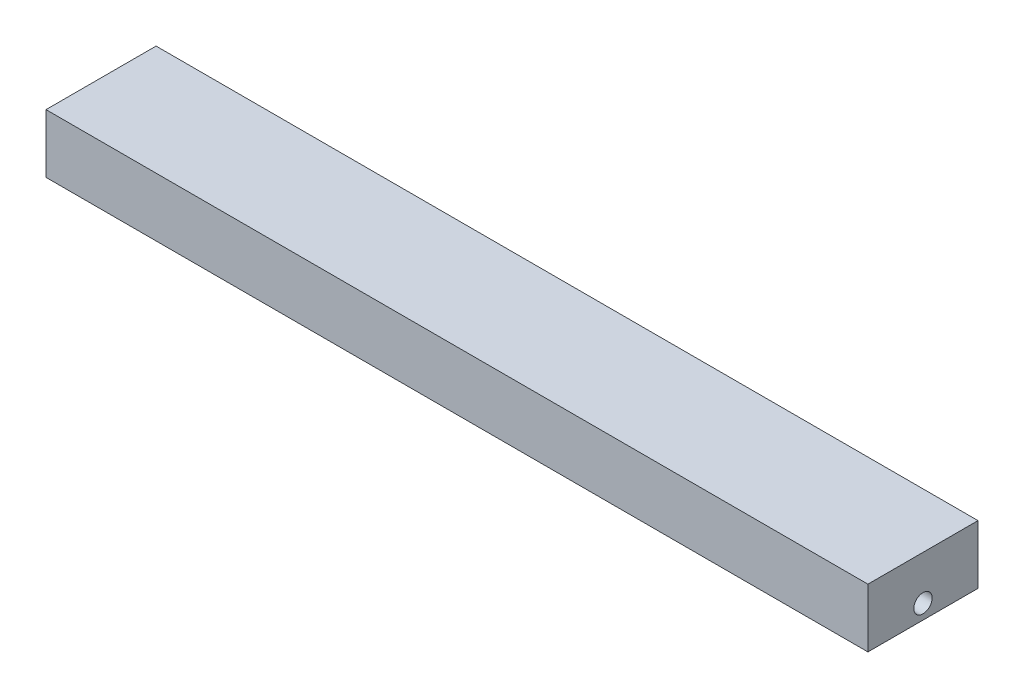
ISO-10303-21;
HEADER;
FILE_DESCRIPTION(('STEP AP214'),'2;1');
FILE_NAME('part.step','',(''),(''),'','','');
FILE_SCHEMA(('AUTOMOTIVE_DESIGN { 1 0 10303 214 1 1 1 1 }'));
ENDSEC;
DATA;
#1=APPLICATION_CONTEXT('core data for automotive mechanical design processes');
#2=APPLICATION_PROTOCOL_DEFINITION('international standard','automotive_design',2000,#1);
#3=PRODUCT_CONTEXT('',#1,'mechanical');
#4=PRODUCT('Part','Part','',(#3));
#5=PRODUCT_RELATED_PRODUCT_CATEGORY('part','',(#4));
#6=PRODUCT_DEFINITION_FORMATION('','',#4);
#7=PRODUCT_DEFINITION_CONTEXT('part definition',#1,'design');
#8=PRODUCT_DEFINITION('design','',#6,#7);
#9=PRODUCT_DEFINITION_SHAPE('','',#8);
#10=(LENGTH_UNIT() NAMED_UNIT(*) SI_UNIT(.MILLI.,.METRE.));
#11=(NAMED_UNIT(*) PLANE_ANGLE_UNIT() SI_UNIT($,.RADIAN.));
#12=(NAMED_UNIT(*) SI_UNIT($,.STERADIAN.) SOLID_ANGLE_UNIT());
#13=UNCERTAINTY_MEASURE_WITH_UNIT(LENGTH_MEASURE(1.E-05),#10,'distance_accuracy_value','');
#14=(GEOMETRIC_REPRESENTATION_CONTEXT(3) GLOBAL_UNCERTAINTY_ASSIGNED_CONTEXT((#13)) GLOBAL_UNIT_ASSIGNED_CONTEXT((#10,
#11,#12)) REPRESENTATION_CONTEXT('',''));
#15=CARTESIAN_POINT('',(0.,0.,0.));
#16=DIRECTION('',(0.,0.,1.));
#17=DIRECTION('',(1.,0.,0.));
#18=AXIS2_PLACEMENT_3D('',#15,#16,#17);
#19=CARTESIAN_POINT('',(56.,8.,7.5));
#20=DIRECTION('',(-1.,0.,0.));
#21=DIRECTION('',(0.,0.,1.));
#22=AXIS2_PLACEMENT_3D('',#19,#20,#21);
#23=PLANE('',#22);
#24=CARTESIAN_POINT('',(56.,2.,0.));
#25=DIRECTION('',(1.,0.,0.));
#26=DIRECTION('',(0.,0.,-1.));
#27=AXIS2_PLACEMENT_3D('',#24,#25,#26);
#28=CIRCLE('',#27,1.25);
#29=CARTESIAN_POINT('',(56.,2.,-1.25));
#30=VERTEX_POINT('',#29);
#31=EDGE_CURVE('E110',#30,#30,#28,.T.);
#32=ORIENTED_EDGE('',*,*,#31,.F.);
#33=EDGE_LOOP('',(#32));
#34=FACE_BOUND('',#33,.T.);
#35=DIRECTION('',(0.,0.,-1.));
#36=VECTOR('',#35,1.);
#37=CARTESIAN_POINT('',(56.,0.,7.5));
#38=LINE('',#37,#36);
#39=CARTESIAN_POINT('',(56.,0.,7.5));
#40=VERTEX_POINT('',#39);
#41=CARTESIAN_POINT('',(56.,0.,-7.5));
#42=VERTEX_POINT('',#41);
#43=EDGE_CURVE('E96',#40,#42,#38,.T.);
#44=ORIENTED_EDGE('',*,*,#43,.T.);
#45=DIRECTION('',(0.,-1.,0.));
#46=VECTOR('',#45,1.);
#47=CARTESIAN_POINT('',(56.,8.,-7.5));
#48=LINE('',#47,#46);
#49=CARTESIAN_POINT('',(56.,8.,-7.5));
#50=VERTEX_POINT('',#49);
#51=EDGE_CURVE('E11',#50,#42,#48,.T.);
#52=ORIENTED_EDGE('',*,*,#51,.F.);
#53=DIRECTION('',(0.,0.,-1.));
#54=VECTOR('',#53,1.);
#55=CARTESIAN_POINT('',(56.,8.,7.5));
#56=LINE('',#55,#54);
#57=CARTESIAN_POINT('',(56.,8.,7.5));
#58=VERTEX_POINT('',#57);
#59=EDGE_CURVE('E84',#58,#50,#56,.T.);
#60=ORIENTED_EDGE('',*,*,#59,.F.);
#61=DIRECTION('',(0.,-1.,0.));
#62=VECTOR('',#61,1.);
#63=CARTESIAN_POINT('',(56.,8.,7.5));
#64=LINE('',#63,#62);
#65=EDGE_CURVE('E92',#58,#40,#64,.T.);
#66=ORIENTED_EDGE('',*,*,#65,.T.);
#67=EDGE_LOOP('',(#44,#52,#60,#66));
#68=FACE_BOUND('',#67,.T.);
#69=ADVANCED_FACE('F33',(#34,#68),#23,.F.);
#70=CARTESIAN_POINT('',(-56.,8.,-7.5));
#71=DIRECTION('',(0.,0.,1.));
#72=DIRECTION('',(1.,0.,0.));
#73=AXIS2_PLACEMENT_3D('',#70,#71,#72);
#74=PLANE('',#73);
#75=DIRECTION('',(-1.,0.,0.));
#76=VECTOR('',#75,1.);
#77=CARTESIAN_POINT('',(-56.,0.,-7.5));
#78=LINE('',#77,#76);
#79=CARTESIAN_POINT('',(-56.,0.,-7.5));
#80=VERTEX_POINT('',#79);
#81=EDGE_CURVE('E88',#42,#80,#78,.T.);
#82=ORIENTED_EDGE('',*,*,#81,.T.);
#83=DIRECTION('',(0.,-1.,0.));
#84=VECTOR('',#83,1.);
#85=CARTESIAN_POINT('',(-56.,8.,-7.5));
#86=LINE('',#85,#84);
#87=CARTESIAN_POINT('',(-56.,8.,-7.5));
#88=VERTEX_POINT('',#87);
#89=EDGE_CURVE('E41',#88,#80,#86,.T.);
#90=ORIENTED_EDGE('',*,*,#89,.F.);
#91=DIRECTION('',(-1.,0.,0.));
#92=VECTOR('',#91,1.);
#93=CARTESIAN_POINT('',(-56.,8.,-7.5));
#94=LINE('',#93,#92);
#95=EDGE_CURVE('E79',#50,#88,#94,.T.);
#96=ORIENTED_EDGE('',*,*,#95,.F.);
#97=ORIENTED_EDGE('',*,*,#51,.T.);
#98=EDGE_LOOP('',(#82,#90,#96,#97));
#99=FACE_BOUND('',#98,.T.);
#100=ADVANCED_FACE('F87',(#99),#74,.F.);
#101=CARTESIAN_POINT('',(-56.,8.,7.5));
#102=DIRECTION('',(1.,0.,0.));
#103=DIRECTION('',(0.,0.,-1.));
#104=AXIS2_PLACEMENT_3D('',#101,#102,#103);
#105=PLANE('',#104);
#106=CARTESIAN_POINT('',(-56.,2.,0.));
#107=DIRECTION('',(1.,0.,0.));
#108=DIRECTION('',(0.,0.,-1.));
#109=AXIS2_PLACEMENT_3D('',#106,#107,#108);
#110=CIRCLE('',#109,1.25);
#111=CARTESIAN_POINT('',(-56.,2.,-1.25));
#112=VERTEX_POINT('',#111);
#113=EDGE_CURVE('E99',#112,#112,#110,.T.);
#114=ORIENTED_EDGE('',*,*,#113,.T.);
#115=EDGE_LOOP('',(#114));
#116=FACE_BOUND('',#115,.T.);
#117=DIRECTION('',(0.,0.,1.));
#118=VECTOR('',#117,1.);
#119=CARTESIAN_POINT('',(-56.,0.,7.5));
#120=LINE('',#119,#118);
#121=CARTESIAN_POINT('',(-56.,0.,7.5));
#122=VERTEX_POINT('',#121);
#123=EDGE_CURVE('E66',#80,#122,#120,.T.);
#124=ORIENTED_EDGE('',*,*,#123,.T.);
#125=DIRECTION('',(0.,-1.,0.));
#126=VECTOR('',#125,1.);
#127=CARTESIAN_POINT('',(-56.,8.,7.5));
#128=LINE('',#127,#126);
#129=CARTESIAN_POINT('',(-56.,8.,7.5));
#130=VERTEX_POINT('',#129);
#131=EDGE_CURVE('E89',#130,#122,#128,.T.);
#132=ORIENTED_EDGE('',*,*,#131,.F.);
#133=DIRECTION('',(0.,0.,1.));
#134=VECTOR('',#133,1.);
#135=CARTESIAN_POINT('',(-56.,8.,7.5));
#136=LINE('',#135,#134);
#137=EDGE_CURVE('E82',#88,#130,#136,.T.);
#138=ORIENTED_EDGE('',*,*,#137,.F.);
#139=ORIENTED_EDGE('',*,*,#89,.T.);
#140=EDGE_LOOP('',(#124,#132,#138,#139));
#141=FACE_BOUND('',#140,.T.);
#142=ADVANCED_FACE('F90',(#116,#141),#105,.F.);
#143=CARTESIAN_POINT('',(-56.,8.,7.5));
#144=DIRECTION('',(0.,0.,-1.));
#145=DIRECTION('',(-1.,0.,0.));
#146=AXIS2_PLACEMENT_3D('',#143,#144,#145);
#147=PLANE('',#146);
#148=DIRECTION('',(1.,0.,0.));
#149=VECTOR('',#148,1.);
#150=CARTESIAN_POINT('',(-56.,0.,7.5));
#151=LINE('',#150,#149);
#152=EDGE_CURVE('E72',#122,#40,#151,.T.);
#153=ORIENTED_EDGE('',*,*,#152,.T.);
#154=ORIENTED_EDGE('',*,*,#65,.F.);
#155=DIRECTION('',(1.,0.,0.));
#156=VECTOR('',#155,1.);
#157=CARTESIAN_POINT('',(-56.,8.,7.5));
#158=LINE('',#157,#156);
#159=EDGE_CURVE('E49',#130,#58,#158,.T.);
#160=ORIENTED_EDGE('',*,*,#159,.F.);
#161=ORIENTED_EDGE('',*,*,#131,.T.);
#162=EDGE_LOOP('',(#153,#154,#160,#161));
#163=FACE_BOUND('',#162,.T.);
#164=ADVANCED_FACE('F104',(#163),#147,.F.);
#165=CARTESIAN_POINT('',(0.,8.,0.));
#166=DIRECTION('',(0.,-1.,0.));
#167=DIRECTION('',(0.,0.,-1.));
#168=AXIS2_PLACEMENT_3D('',#165,#166,#167);
#169=PLANE('',#168);
#170=ORIENTED_EDGE('',*,*,#59,.T.);
#171=ORIENTED_EDGE('',*,*,#95,.T.);
#172=ORIENTED_EDGE('',*,*,#137,.T.);
#173=ORIENTED_EDGE('',*,*,#159,.T.);
#174=EDGE_LOOP('',(#170,#171,#172,#173));
#175=FACE_BOUND('',#174,.T.);
#176=ADVANCED_FACE('F80',(#175),#169,.F.);
#177=CARTESIAN_POINT('',(0.,0.,0.));
#178=DIRECTION('',(0.,-1.,0.));
#179=DIRECTION('',(0.,0.,-1.));
#180=AXIS2_PLACEMENT_3D('',#177,#178,#179);
#181=PLANE('',#180);
#182=ORIENTED_EDGE('',*,*,#43,.F.);
#183=ORIENTED_EDGE('',*,*,#152,.F.);
#184=ORIENTED_EDGE('',*,*,#123,.F.);
#185=ORIENTED_EDGE('',*,*,#81,.F.);
#186=EDGE_LOOP('',(#182,#183,#184,#185));
#187=FACE_BOUND('',#186,.T.);
#188=ADVANCED_FACE('F107',(#187),#181,.T.);
#189=CARTESIAN_POINT('',(-56.,2.,0.));
#190=DIRECTION('',(1.,0.,0.));
#191=DIRECTION('',(0.,0.,-1.));
#192=AXIS2_PLACEMENT_3D('',#189,#190,#191);
#193=CYLINDRICAL_SURFACE('',#192,1.25);
#194=ORIENTED_EDGE('',*,*,#113,.F.);
#195=EDGE_LOOP('',(#194));
#196=FACE_BOUND('',#195,.T.);
#197=ORIENTED_EDGE('',*,*,#31,.T.);
#198=EDGE_LOOP('',(#197));
#199=FACE_BOUND('',#198,.T.);
#200=ADVANCED_FACE('F117',(#196,#199),#193,.F.);
#201=CLOSED_SHELL('',(#69,#100,#142,#164,#176,#188,#200));
#202=MANIFOLD_SOLID_BREP('B2',#201);
#203=ADVANCED_BREP_SHAPE_REPRESENTATION('',(#18,#202),#14);
#204=SHAPE_DEFINITION_REPRESENTATION(#9,#203);
ENDSEC;
END-ISO-10303-21;
